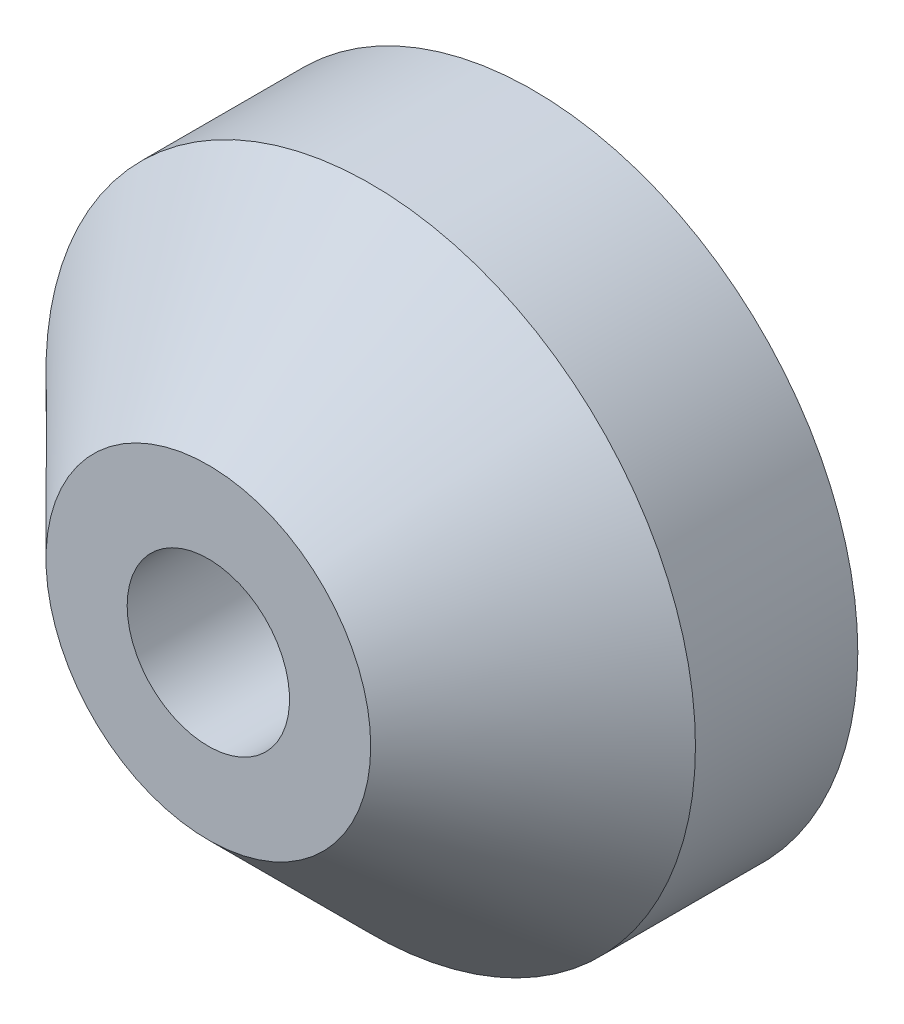
ISO-10303-21;
HEADER;
FILE_DESCRIPTION(('STEP AP214'),'2;1');
FILE_NAME('part.step','',(''),(''),'','','');
FILE_SCHEMA(('AUTOMOTIVE_DESIGN { 1 0 10303 214 1 1 1 1 }'));
ENDSEC;
DATA;
#1=APPLICATION_CONTEXT('core data for automotive mechanical design processes');
#2=APPLICATION_PROTOCOL_DEFINITION('international standard','automotive_design',2000,#1);
#3=PRODUCT_CONTEXT('',#1,'mechanical');
#4=PRODUCT('Part','Part','',(#3));
#5=PRODUCT_RELATED_PRODUCT_CATEGORY('part','',(#4));
#6=PRODUCT_DEFINITION_FORMATION('','',#4);
#7=PRODUCT_DEFINITION_CONTEXT('part definition',#1,'design');
#8=PRODUCT_DEFINITION('design','',#6,#7);
#9=PRODUCT_DEFINITION_SHAPE('','',#8);
#10=(LENGTH_UNIT() NAMED_UNIT(*) SI_UNIT(.MILLI.,.METRE.));
#11=(NAMED_UNIT(*) PLANE_ANGLE_UNIT() SI_UNIT($,.RADIAN.));
#12=(NAMED_UNIT(*) SI_UNIT($,.STERADIAN.) SOLID_ANGLE_UNIT());
#13=UNCERTAINTY_MEASURE_WITH_UNIT(LENGTH_MEASURE(1.E-05),#10,'distance_accuracy_value','');
#14=(GEOMETRIC_REPRESENTATION_CONTEXT(3) GLOBAL_UNCERTAINTY_ASSIGNED_CONTEXT((#13)) GLOBAL_UNIT_ASSIGNED_CONTEXT((#10,
#11,#12)) REPRESENTATION_CONTEXT('',''));
#15=CARTESIAN_POINT('',(0.,0.,0.));
#16=DIRECTION('',(0.,0.,1.));
#17=DIRECTION('',(1.,0.,0.));
#18=AXIS2_PLACEMENT_3D('',#15,#16,#17);
#19=CARTESIAN_POINT('',(0.,0.,5.));
#20=DIRECTION('',(0.,0.,-1.));
#21=DIRECTION('',(-1.,0.,0.));
#22=AXIS2_PLACEMENT_3D('',#19,#20,#21);
#23=CYLINDRICAL_SURFACE('',#22,1.25);
#24=CARTESIAN_POINT('',(0.,0.,5.));
#25=DIRECTION('',(0.,0.,-1.));
#26=DIRECTION('',(-1.,0.,0.));
#27=AXIS2_PLACEMENT_3D('',#24,#25,#26);
#28=CIRCLE('',#27,1.25);
#29=CARTESIAN_POINT('',(-1.25,0.,5.));
#30=VERTEX_POINT('',#29);
#31=EDGE_CURVE('E56',#30,#30,#28,.T.);
#32=ORIENTED_EDGE('',*,*,#31,.F.);
#33=EDGE_LOOP('',(#32));
#34=FACE_BOUND('',#33,.T.);
#35=CARTESIAN_POINT('',(0.,0.,2.5));
#36=DIRECTION('',(0.,0.,-1.));
#37=DIRECTION('',(-1.,0.,0.));
#38=AXIS2_PLACEMENT_3D('',#35,#36,#37);
#39=CIRCLE('',#38,1.25);
#40=CARTESIAN_POINT('',(-1.25,0.,2.5));
#41=VERTEX_POINT('',#40);
#42=EDGE_CURVE('E43',#41,#41,#39,.F.);
#43=ORIENTED_EDGE('',*,*,#42,.F.);
#44=EDGE_LOOP('',(#43));
#45=FACE_BOUND('',#44,.T.);
#46=ADVANCED_FACE('F38',(#34,#45),#23,.F.);
#47=CARTESIAN_POINT('',(0.,0.,5.));
#48=DIRECTION('',(0.,0.,-1.));
#49=DIRECTION('',(-1.,0.,0.));
#50=AXIS2_PLACEMENT_3D('',#47,#48,#49);
#51=CYLINDRICAL_SURFACE('',#50,5.);
#52=CARTESIAN_POINT('',(0.,0.,2.49999999999999));
#53=DIRECTION('',(0.,0.,1.));
#54=DIRECTION('',(1.,0.,0.));
#55=AXIS2_PLACEMENT_3D('',#52,#53,#54);
#56=CIRCLE('',#55,5.);
#57=CARTESIAN_POINT('',(5.,0.,2.49999999999999));
#58=VERTEX_POINT('',#57);
#59=EDGE_CURVE('E10',#58,#58,#56,.F.);
#60=ORIENTED_EDGE('',*,*,#59,.T.);
#61=EDGE_LOOP('',(#60));
#62=FACE_BOUND('',#61,.T.);
#63=CARTESIAN_POINT('',(0.,0.,0.));
#64=DIRECTION('',(0.,0.,1.));
#65=DIRECTION('',(1.,0.,0.));
#66=AXIS2_PLACEMENT_3D('',#63,#64,#65);
#67=CIRCLE('',#66,5.);
#68=CARTESIAN_POINT('',(5.,0.,0.));
#69=VERTEX_POINT('',#68);
#70=EDGE_CURVE('E51',#69,#69,#67,.T.);
#71=ORIENTED_EDGE('',*,*,#70,.T.);
#72=EDGE_LOOP('',(#71));
#73=FACE_BOUND('',#72,.T.);
#74=ADVANCED_FACE('F72',(#62,#73),#51,.T.);
#75=CARTESIAN_POINT('',(0.,0.,5.));
#76=DIRECTION('',(0.,0.,1.));
#77=DIRECTION('',(1.,0.,0.));
#78=AXIS2_PLACEMENT_3D('',#75,#76,#77);
#79=PLANE('',#78);
#80=ORIENTED_EDGE('',*,*,#31,.T.);
#81=EDGE_LOOP('',(#80));
#82=FACE_BOUND('',#81,.T.);
#83=CARTESIAN_POINT('',(0.,0.,5.));
#84=DIRECTION('',(0.,0.,1.));
#85=DIRECTION('',(1.,0.,0.));
#86=AXIS2_PLACEMENT_3D('',#83,#84,#85);
#87=CIRCLE('',#86,2.5);
#88=CARTESIAN_POINT('',(2.5,0.,5.));
#89=VERTEX_POINT('',#88);
#90=EDGE_CURVE('E47',#89,#89,#87,.T.);
#91=ORIENTED_EDGE('',*,*,#90,.T.);
#92=EDGE_LOOP('',(#91));
#93=FACE_BOUND('',#92,.T.);
#94=ADVANCED_FACE('F78',(#82,#93),#79,.T.);
#95=CARTESIAN_POINT('',(0.,0.,0.));
#96=DIRECTION('',(0.,0.,1.));
#97=DIRECTION('',(1.,0.,0.));
#98=AXIS2_PLACEMENT_3D('',#95,#96,#97);
#99=PLANE('',#98);
#100=CARTESIAN_POINT('',(0.,0.,0.));
#101=DIRECTION('',(0.,0.,-1.));
#102=DIRECTION('',(-1.,0.,0.));
#103=AXIS2_PLACEMENT_3D('',#100,#101,#102);
#104=CIRCLE('',#103,2.5);
#105=CARTESIAN_POINT('',(-2.5,0.,0.));
#106=VERTEX_POINT('',#105);
#107=EDGE_CURVE('E59',#106,#106,#104,.T.);
#108=ORIENTED_EDGE('',*,*,#107,.F.);
#109=EDGE_LOOP('',(#108));
#110=FACE_BOUND('',#109,.T.);
#111=ORIENTED_EDGE('',*,*,#70,.F.);
#112=EDGE_LOOP('',(#111));
#113=FACE_BOUND('',#112,.T.);
#114=ADVANCED_FACE('F86',(#110,#113),#99,.F.);
#115=CARTESIAN_POINT('',(0.,0.,5.));
#116=DIRECTION('',(0.,0.,-1.));
#117=DIRECTION('',(-1.,0.,0.));
#118=AXIS2_PLACEMENT_3D('',#115,#116,#117);
#119=CONICAL_SURFACE('',#118,2.5,0.785398163397447);
#120=ORIENTED_EDGE('',*,*,#59,.F.);
#121=EDGE_LOOP('',(#120));
#122=FACE_BOUND('',#121,.T.);
#123=ORIENTED_EDGE('',*,*,#90,.F.);
#124=EDGE_LOOP('',(#123));
#125=FACE_BOUND('',#124,.T.);
#126=ADVANCED_FACE('F41',(#122,#125),#119,.T.);
#127=CARTESIAN_POINT('',(0.,0.,2.5));
#128=DIRECTION('',(0.,0.,-1.));
#129=DIRECTION('',(-1.,0.,0.));
#130=AXIS2_PLACEMENT_3D('',#127,#128,#129);
#131=PLANE('',#130);
#132=CARTESIAN_POINT('',(0.,0.,2.5));
#133=DIRECTION('',(0.,0.,-1.));
#134=DIRECTION('',(-1.,0.,0.));
#135=AXIS2_PLACEMENT_3D('',#132,#133,#134);
#136=CIRCLE('',#135,2.5);
#137=CARTESIAN_POINT('',(-2.5,0.,2.5));
#138=VERTEX_POINT('',#137);
#139=EDGE_CURVE('E62',#138,#138,#136,.T.);
#140=ORIENTED_EDGE('',*,*,#139,.T.);
#141=EDGE_LOOP('',(#140));
#142=FACE_BOUND('',#141,.T.);
#143=ORIENTED_EDGE('',*,*,#42,.T.);
#144=EDGE_LOOP('',(#143));
#145=FACE_BOUND('',#144,.T.);
#146=ADVANCED_FACE('F69',(#142,#145),#131,.T.);
#147=CARTESIAN_POINT('',(0.,0.,2.5));
#148=DIRECTION('',(0.,0.,-1.));
#149=DIRECTION('',(-1.,0.,0.));
#150=AXIS2_PLACEMENT_3D('',#147,#148,#149);
#151=CYLINDRICAL_SURFACE('',#150,2.5);
#152=ORIENTED_EDGE('',*,*,#139,.F.);
#153=EDGE_LOOP('',(#152));
#154=FACE_BOUND('',#153,.T.);
#155=ORIENTED_EDGE('',*,*,#107,.T.);
#156=EDGE_LOOP('',(#155));
#157=FACE_BOUND('',#156,.T.);
#158=ADVANCED_FACE('F82',(#154,#157),#151,.F.);
#159=CLOSED_SHELL('',(#46,#74,#94,#114,#126,#146,#158));
#160=MANIFOLD_SOLID_BREP('B2',#159);
#161=ADVANCED_BREP_SHAPE_REPRESENTATION('',(#18,#160),#14);
#162=SHAPE_DEFINITION_REPRESENTATION(#9,#161);
ENDSEC;
END-ISO-10303-21;
